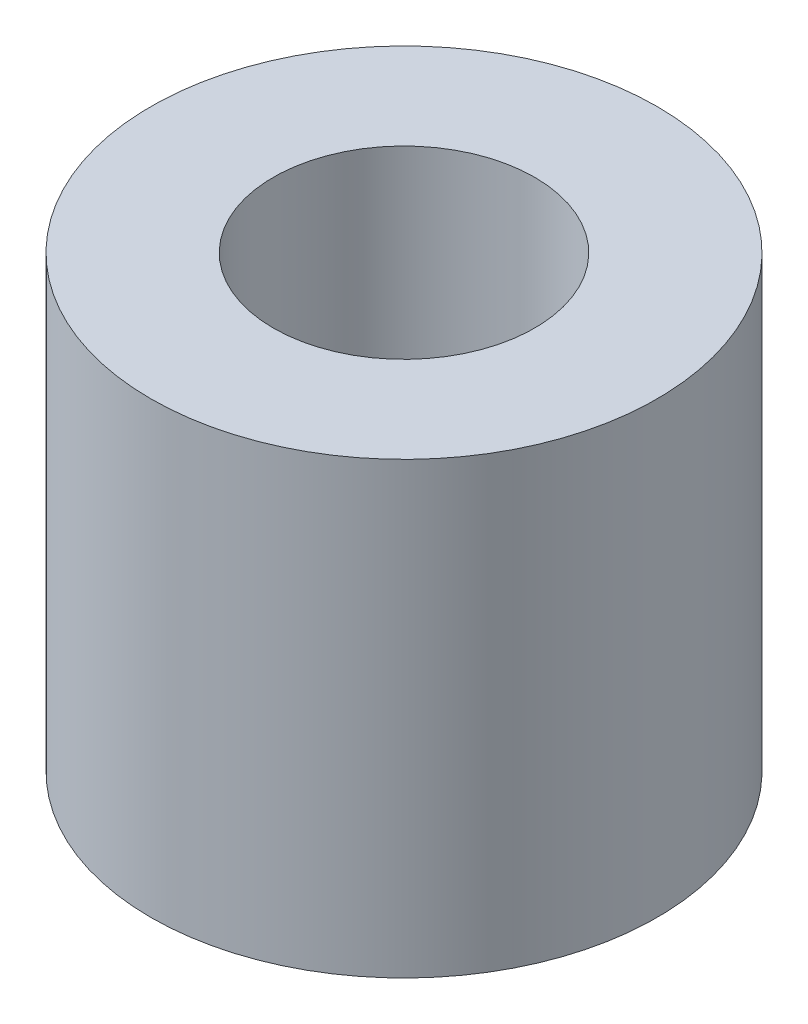
ISO-10303-21;
HEADER;
FILE_DESCRIPTION(('STEP AP214'),'2;1');
FILE_NAME('part.step','',(''),(''),'','','');
FILE_SCHEMA(('AUTOMOTIVE_DESIGN { 1 0 10303 214 1 1 1 1 }'));
ENDSEC;
DATA;
#1=APPLICATION_CONTEXT('core data for automotive mechanical design processes');
#2=APPLICATION_PROTOCOL_DEFINITION('international standard','automotive_design',2000,#1);
#3=PRODUCT_CONTEXT('',#1,'mechanical');
#4=PRODUCT('Part','Part','',(#3));
#5=PRODUCT_RELATED_PRODUCT_CATEGORY('part','',(#4));
#6=PRODUCT_DEFINITION_FORMATION('','',#4);
#7=PRODUCT_DEFINITION_CONTEXT('part definition',#1,'design');
#8=PRODUCT_DEFINITION('design','',#6,#7);
#9=PRODUCT_DEFINITION_SHAPE('','',#8);
#10=(LENGTH_UNIT() NAMED_UNIT(*) SI_UNIT(.MILLI.,.METRE.));
#11=(NAMED_UNIT(*) PLANE_ANGLE_UNIT() SI_UNIT($,.RADIAN.));
#12=(NAMED_UNIT(*) SI_UNIT($,.STERADIAN.) SOLID_ANGLE_UNIT());
#13=UNCERTAINTY_MEASURE_WITH_UNIT(LENGTH_MEASURE(1.E-05),#10,'distance_accuracy_value','');
#14=(GEOMETRIC_REPRESENTATION_CONTEXT(3) GLOBAL_UNCERTAINTY_ASSIGNED_CONTEXT((#13)) GLOBAL_UNIT_ASSIGNED_CONTEXT((#10,
#11,#12)) REPRESENTATION_CONTEXT('',''));
#15=CARTESIAN_POINT('',(0.,0.,0.));
#16=DIRECTION('',(0.,0.,1.));
#17=DIRECTION('',(1.,0.,0.));
#18=AXIS2_PLACEMENT_3D('',#15,#16,#17);
#19=CARTESIAN_POINT('',(0.,5.5,0.));
#20=DIRECTION('',(0.,1.,0.));
#21=DIRECTION('',(0.,0.,1.));
#22=AXIS2_PLACEMENT_3D('',#19,#20,#21);
#23=PLANE('',#22);
#24=CARTESIAN_POINT('',(0.,5.5,0.));
#25=DIRECTION('',(0.,1.,0.));
#26=DIRECTION('',(0.,0.,1.));
#27=AXIS2_PLACEMENT_3D('',#24,#25,#26);
#28=CIRCLE('',#27,3.1);
#29=CARTESIAN_POINT('',(0.,5.5,3.1));
#30=VERTEX_POINT('',#29);
#31=EDGE_CURVE('E10',#30,#30,#28,.T.);
#32=ORIENTED_EDGE('',*,*,#31,.T.);
#33=EDGE_LOOP('',(#32));
#34=FACE_BOUND('',#33,.T.);
#35=CARTESIAN_POINT('',(0.,5.5,0.));
#36=DIRECTION('',(0.,1.,0.));
#37=DIRECTION('',(0.,0.,1.));
#38=AXIS2_PLACEMENT_3D('',#35,#36,#37);
#39=CIRCLE('',#38,1.6);
#40=CARTESIAN_POINT('',(0.,5.5,1.6));
#41=VERTEX_POINT('',#40);
#42=EDGE_CURVE('E44',#41,#41,#39,.T.);
#43=ORIENTED_EDGE('',*,*,#42,.F.);
#44=EDGE_LOOP('',(#43));
#45=FACE_BOUND('',#44,.T.);
#46=ADVANCED_FACE('F33',(#34,#45),#23,.T.);
#47=CARTESIAN_POINT('',(0.,0.,0.));
#48=DIRECTION('',(0.,1.,0.));
#49=DIRECTION('',(0.,0.,1.));
#50=AXIS2_PLACEMENT_3D('',#47,#48,#49);
#51=PLANE('',#50);
#52=CARTESIAN_POINT('',(0.,0.,0.));
#53=DIRECTION('',(0.,1.,0.));
#54=DIRECTION('',(0.,0.,1.));
#55=AXIS2_PLACEMENT_3D('',#52,#53,#54);
#56=CIRCLE('',#55,3.1);
#57=CARTESIAN_POINT('',(0.,0.,3.1));
#58=VERTEX_POINT('',#57);
#59=EDGE_CURVE('E37',#58,#58,#56,.T.);
#60=ORIENTED_EDGE('',*,*,#59,.F.);
#61=EDGE_LOOP('',(#60));
#62=FACE_BOUND('',#61,.T.);
#63=CARTESIAN_POINT('',(0.,0.,0.));
#64=DIRECTION('',(0.,1.,0.));
#65=DIRECTION('',(0.,0.,1.));
#66=AXIS2_PLACEMENT_3D('',#63,#64,#65);
#67=CIRCLE('',#66,1.6);
#68=CARTESIAN_POINT('',(0.,0.,1.6));
#69=VERTEX_POINT('',#68);
#70=EDGE_CURVE('E46',#69,#69,#67,.T.);
#71=ORIENTED_EDGE('',*,*,#70,.T.);
#72=EDGE_LOOP('',(#71));
#73=FACE_BOUND('',#72,.T.);
#74=ADVANCED_FACE('F56',(#62,#73),#51,.F.);
#75=CARTESIAN_POINT('',(0.,5.5,0.));
#76=DIRECTION('',(0.,-1.,0.));
#77=DIRECTION('',(0.,0.,-1.));
#78=AXIS2_PLACEMENT_3D('',#75,#76,#77);
#79=CYLINDRICAL_SURFACE('',#78,3.1);
#80=ORIENTED_EDGE('',*,*,#31,.F.);
#81=EDGE_LOOP('',(#80));
#82=FACE_BOUND('',#81,.T.);
#83=ORIENTED_EDGE('',*,*,#59,.T.);
#84=EDGE_LOOP('',(#83));
#85=FACE_BOUND('',#84,.T.);
#86=ADVANCED_FACE('F35',(#82,#85),#79,.T.);
#87=CARTESIAN_POINT('',(0.,5.5,0.));
#88=DIRECTION('',(0.,-1.,0.));
#89=DIRECTION('',(0.,0.,-1.));
#90=AXIS2_PLACEMENT_3D('',#87,#88,#89);
#91=CYLINDRICAL_SURFACE('',#90,1.6);
#92=ORIENTED_EDGE('',*,*,#42,.T.);
#93=EDGE_LOOP('',(#92));
#94=FACE_BOUND('',#93,.T.);
#95=ORIENTED_EDGE('',*,*,#70,.F.);
#96=EDGE_LOOP('',(#95));
#97=FACE_BOUND('',#96,.T.);
#98=ADVANCED_FACE('F52',(#94,#97),#91,.F.);
#99=CLOSED_SHELL('',(#46,#74,#86,#98));
#100=MANIFOLD_SOLID_BREP('B2',#99);
#101=ADVANCED_BREP_SHAPE_REPRESENTATION('',(#18,#100),#14);
#102=SHAPE_DEFINITION_REPRESENTATION(#9,#101);
ENDSEC;
END-ISO-10303-21;
